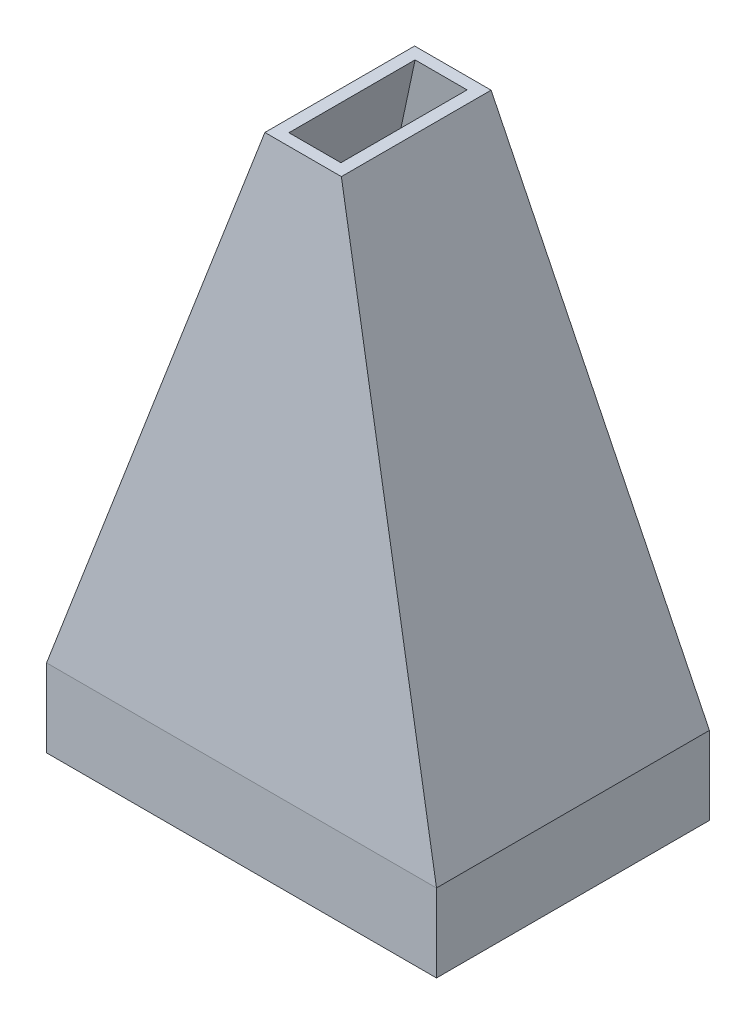
ISO-10303-21;
HEADER;
FILE_DESCRIPTION(('STEP AP214'),'2;1');
FILE_NAME('part.step','',(''),(''),'','','');
FILE_SCHEMA(('AUTOMOTIVE_DESIGN { 1 0 10303 214 1 1 1 1 }'));
ENDSEC;
DATA;
#1=APPLICATION_CONTEXT('core data for automotive mechanical design processes');
#2=APPLICATION_PROTOCOL_DEFINITION('international standard','automotive_design',2000,#1);
#3=PRODUCT_CONTEXT('',#1,'mechanical');
#4=PRODUCT('Part','Part','',(#3));
#5=PRODUCT_RELATED_PRODUCT_CATEGORY('part','',(#4));
#6=PRODUCT_DEFINITION_FORMATION('','',#4);
#7=PRODUCT_DEFINITION_CONTEXT('part definition',#1,'design');
#8=PRODUCT_DEFINITION('design','',#6,#7);
#9=PRODUCT_DEFINITION_SHAPE('','',#8);
#10=(LENGTH_UNIT() NAMED_UNIT(*) SI_UNIT(.MILLI.,.METRE.));
#11=(NAMED_UNIT(*) PLANE_ANGLE_UNIT() SI_UNIT($,.RADIAN.));
#12=(NAMED_UNIT(*) SI_UNIT($,.STERADIAN.) SOLID_ANGLE_UNIT());
#13=UNCERTAINTY_MEASURE_WITH_UNIT(LENGTH_MEASURE(1.E-05),#10,'distance_accuracy_value','');
#14=(GEOMETRIC_REPRESENTATION_CONTEXT(3) GLOBAL_UNCERTAINTY_ASSIGNED_CONTEXT((#13)) GLOBAL_UNIT_ASSIGNED_CONTEXT((#10,
#11,#12)) REPRESENTATION_CONTEXT('',''));
#15=CARTESIAN_POINT('',(0.,0.,0.));
#16=DIRECTION('',(0.,0.,1.));
#17=DIRECTION('',(1.,0.,0.));
#18=AXIS2_PLACEMENT_3D('',#15,#16,#17);
#19=CARTESIAN_POINT('',(0.,150.,0.));
#20=DIRECTION('',(0.,-1.,0.));
#21=DIRECTION('',(0.,0.,-1.));
#22=AXIS2_PLACEMENT_3D('',#19,#20,#21);
#23=PLANE('',#22);
#24=DIRECTION('',(-1.,0.,0.));
#25=VECTOR('',#24,1.);
#26=CARTESIAN_POINT('',(50.,150.,-19.2));
#27=LINE('',#26,#25);
#28=CARTESIAN_POINT('',(9.80833333333334,150.,-19.2));
#29=VERTEX_POINT('',#28);
#30=CARTESIAN_POINT('',(-9.80833333333332,150.,-19.2));
#31=VERTEX_POINT('',#30);
#32=EDGE_CURVE('E237',#29,#31,#27,.T.);
#33=ORIENTED_EDGE('',*,*,#32,.T.);
#34=DIRECTION('',(0.,0.,1.));
#35=VECTOR('',#34,1.);
#36=CARTESIAN_POINT('',(-9.80833333333332,150.,-35.));
#37=LINE('',#36,#35);
#38=CARTESIAN_POINT('',(-9.80833333333333,150.,19.2));
#39=VERTEX_POINT('',#38);
#40=EDGE_CURVE('E215',#31,#39,#37,.T.);
#41=ORIENTED_EDGE('',*,*,#40,.T.);
#42=DIRECTION('',(-1.,0.,0.));
#43=VECTOR('',#42,1.);
#44=CARTESIAN_POINT('',(50.,150.,19.2));
#45=LINE('',#44,#43);
#46=CARTESIAN_POINT('',(9.80833333333334,150.,19.2));
#47=VERTEX_POINT('',#46);
#48=EDGE_CURVE('E246',#47,#39,#45,.T.);
#49=ORIENTED_EDGE('',*,*,#48,.F.);
#50=DIRECTION('',(0.,0.,1.));
#51=VECTOR('',#50,1.);
#52=CARTESIAN_POINT('',(9.80833333333334,150.,-35.));
#53=LINE('',#52,#51);
#54=EDGE_CURVE('E223',#29,#47,#53,.T.);
#55=ORIENTED_EDGE('',*,*,#54,.F.);
#56=EDGE_LOOP('',(#33,#41,#49,#55));
#57=FACE_BOUND('',#56,.T.);
#58=DIRECTION('',(-1.,0.,0.));
#59=VECTOR('',#58,1.);
#60=CARTESIAN_POINT('',(0.,150.,-16.1779238297657));
#61=LINE('',#60,#59);
#62=CARTESIAN_POINT('',(6.66822883666449,150.,-16.1779238297657));
#63=VERTEX_POINT('',#62);
#64=CARTESIAN_POINT('',(-6.66822883666446,150.,-16.1779238297657));
#65=VERTEX_POINT('',#64);
#66=EDGE_CURVE('E157',#63,#65,#61,.T.);
#67=ORIENTED_EDGE('',*,*,#66,.F.);
#68=DIRECTION('',(0.,0.,1.));
#69=VECTOR('',#68,1.);
#70=CARTESIAN_POINT('',(6.66822883666449,150.,-35.));
#71=LINE('',#70,#69);
#72=CARTESIAN_POINT('',(6.66822883666449,150.,16.1779238297657));
#73=VERTEX_POINT('',#72);
#74=EDGE_CURVE('E165',#63,#73,#71,.T.);
#75=ORIENTED_EDGE('',*,*,#74,.T.);
#76=DIRECTION('',(-1.,0.,0.));
#77=VECTOR('',#76,1.);
#78=CARTESIAN_POINT('',(50.,150.,16.1779238297657));
#79=LINE('',#78,#77);
#80=CARTESIAN_POINT('',(-6.66822883666446,150.,16.1779238297657));
#81=VERTEX_POINT('',#80);
#82=EDGE_CURVE('E60',#73,#81,#79,.T.);
#83=ORIENTED_EDGE('',*,*,#82,.T.);
#84=DIRECTION('',(0.,0.,1.));
#85=VECTOR('',#84,1.);
#86=CARTESIAN_POINT('',(-6.66822883666446,150.,0.));
#87=LINE('',#86,#85);
#88=EDGE_CURVE('E210',#65,#81,#87,.T.);
#89=ORIENTED_EDGE('',*,*,#88,.F.);
#90=EDGE_LOOP('',(#67,#75,#83,#89));
#91=FACE_BOUND('',#90,.T.);
#92=ADVANCED_FACE('F44',(#57,#91),#23,.F.);
#93=CARTESIAN_POINT('',(0.,0.,0.));
#94=DIRECTION('',(0.,-1.,0.));
#95=DIRECTION('',(0.,0.,-1.));
#96=AXIS2_PLACEMENT_3D('',#93,#94,#95);
#97=PLANE('',#96);
#98=DIRECTION('',(0.,0.,-1.));
#99=VECTOR('',#98,1.);
#100=CARTESIAN_POINT('',(50.,0.,35.));
#101=LINE('',#100,#99);
#102=CARTESIAN_POINT('',(50.,0.,35.));
#103=VERTEX_POINT('',#102);
#104=CARTESIAN_POINT('',(50.,0.,-35.));
#105=VERTEX_POINT('',#104);
#106=EDGE_CURVE('E241',#103,#105,#101,.T.);
#107=ORIENTED_EDGE('',*,*,#106,.F.);
#108=DIRECTION('',(1.,0.,0.));
#109=VECTOR('',#108,1.);
#110=CARTESIAN_POINT('',(-50.,0.,35.));
#111=LINE('',#110,#109);
#112=CARTESIAN_POINT('',(-50.,0.,35.));
#113=VERTEX_POINT('',#112);
#114=EDGE_CURVE('E264',#113,#103,#111,.T.);
#115=ORIENTED_EDGE('',*,*,#114,.F.);
#116=DIRECTION('',(0.,0.,1.));
#117=VECTOR('',#116,1.);
#118=CARTESIAN_POINT('',(-50.,0.,35.));
#119=LINE('',#118,#117);
#120=CARTESIAN_POINT('',(-50.,0.,-35.));
#121=VERTEX_POINT('',#120);
#122=EDGE_CURVE('E260',#121,#113,#119,.T.);
#123=ORIENTED_EDGE('',*,*,#122,.F.);
#124=DIRECTION('',(-1.,0.,0.));
#125=VECTOR('',#124,1.);
#126=CARTESIAN_POINT('',(-50.,0.,-35.));
#127=LINE('',#126,#125);
#128=EDGE_CURVE('E256',#105,#121,#127,.T.);
#129=ORIENTED_EDGE('',*,*,#128,.F.);
#130=EDGE_LOOP('',(#107,#115,#123,#129));
#131=FACE_BOUND('',#130,.T.);
#132=DIRECTION('',(1.,0.,0.));
#133=VECTOR('',#132,1.);
#134=CARTESIAN_POINT('',(0.,0.,32.));
#135=LINE('',#134,#133);
#136=CARTESIAN_POINT('',(-47.,0.,32.));
#137=VERTEX_POINT('',#136);
#138=CARTESIAN_POINT('',(47.,0.,32.));
#139=VERTEX_POINT('',#138);
#140=EDGE_CURVE('E191',#137,#139,#135,.T.);
#141=ORIENTED_EDGE('',*,*,#140,.T.);
#142=DIRECTION('',(0.,0.,-1.));
#143=VECTOR('',#142,1.);
#144=CARTESIAN_POINT('',(47.,0.,0.));
#145=LINE('',#144,#143);
#146=CARTESIAN_POINT('',(47.,0.,-32.));
#147=VERTEX_POINT('',#146);
#148=EDGE_CURVE('E186',#139,#147,#145,.T.);
#149=ORIENTED_EDGE('',*,*,#148,.T.);
#150=DIRECTION('',(-1.,0.,0.));
#151=VECTOR('',#150,1.);
#152=CARTESIAN_POINT('',(0.,0.,-32.));
#153=LINE('',#152,#151);
#154=CARTESIAN_POINT('',(-47.,0.,-32.));
#155=VERTEX_POINT('',#154);
#156=EDGE_CURVE('E190',#147,#155,#153,.T.);
#157=ORIENTED_EDGE('',*,*,#156,.T.);
#158=DIRECTION('',(0.,0.,1.));
#159=VECTOR('',#158,1.);
#160=CARTESIAN_POINT('',(-47.,0.,0.));
#161=LINE('',#160,#159);
#162=EDGE_CURVE('E68',#155,#137,#161,.T.);
#163=ORIENTED_EDGE('',*,*,#162,.T.);
#164=EDGE_LOOP('',(#141,#149,#157,#163));
#165=FACE_BOUND('',#164,.T.);
#166=ADVANCED_FACE('F298',(#131,#165),#97,.T.);
#167=CARTESIAN_POINT('',(50.,150.,35.));
#168=DIRECTION('',(-1.,0.,0.));
#169=DIRECTION('',(0.,0.,1.));
#170=AXIS2_PLACEMENT_3D('',#167,#168,#169);
#171=PLANE('',#170);
#172=DIRECTION('',(0.,-1.,0.));
#173=VECTOR('',#172,1.);
#174=CARTESIAN_POINT('',(50.,150.,-35.));
#175=LINE('',#174,#173);
#176=CARTESIAN_POINT('',(50.,20.,-35.));
#177=VERTEX_POINT('',#176);
#178=EDGE_CURVE('E277',#177,#105,#175,.T.);
#179=ORIENTED_EDGE('',*,*,#178,.F.);
#180=DIRECTION('',(0.,0.,1.));
#181=VECTOR('',#180,1.);
#182=CARTESIAN_POINT('',(50.,20.,-35.));
#183=LINE('',#182,#181);
#184=CARTESIAN_POINT('',(50.,20.,35.));
#185=VERTEX_POINT('',#184);
#186=EDGE_CURVE('E179',#177,#185,#183,.T.);
#187=ORIENTED_EDGE('',*,*,#186,.T.);
#188=DIRECTION('',(0.,-1.,0.));
#189=VECTOR('',#188,1.);
#190=CARTESIAN_POINT('',(50.,150.,35.));
#191=LINE('',#190,#189);
#192=EDGE_CURVE('E268',#185,#103,#191,.T.);
#193=ORIENTED_EDGE('',*,*,#192,.T.);
#194=ORIENTED_EDGE('',*,*,#106,.T.);
#195=EDGE_LOOP('',(#179,#187,#193,#194));
#196=FACE_BOUND('',#195,.T.);
#197=ADVANCED_FACE('F46',(#196),#171,.F.);
#198=CARTESIAN_POINT('',(-50.,150.,-35.));
#199=DIRECTION('',(0.,0.,1.));
#200=DIRECTION('',(1.,0.,0.));
#201=AXIS2_PLACEMENT_3D('',#198,#199,#200);
#202=PLANE('',#201);
#203=DIRECTION('',(0.,-1.,0.));
#204=VECTOR('',#203,1.);
#205=CARTESIAN_POINT('',(-50.,150.,-35.));
#206=LINE('',#205,#204);
#207=CARTESIAN_POINT('',(-50.,20.,-35.));
#208=VERTEX_POINT('',#207);
#209=EDGE_CURVE('E274',#208,#121,#206,.T.);
#210=ORIENTED_EDGE('',*,*,#209,.F.);
#211=DIRECTION('',(-1.,0.,0.));
#212=VECTOR('',#211,1.);
#213=CARTESIAN_POINT('',(50.,20.,-35.));
#214=LINE('',#213,#212);
#215=EDGE_CURVE('E242',#177,#208,#214,.T.);
#216=ORIENTED_EDGE('',*,*,#215,.F.);
#217=ORIENTED_EDGE('',*,*,#178,.T.);
#218=ORIENTED_EDGE('',*,*,#128,.T.);
#219=EDGE_LOOP('',(#210,#216,#217,#218));
#220=FACE_BOUND('',#219,.T.);
#221=ADVANCED_FACE('F290',(#220),#202,.F.);
#222=CARTESIAN_POINT('',(-50.,150.,35.));
#223=DIRECTION('',(1.,0.,0.));
#224=DIRECTION('',(0.,0.,-1.));
#225=AXIS2_PLACEMENT_3D('',#222,#223,#224);
#226=PLANE('',#225);
#227=DIRECTION('',(0.,-1.,0.));
#228=VECTOR('',#227,1.);
#229=CARTESIAN_POINT('',(-50.,150.,35.));
#230=LINE('',#229,#228);
#231=CARTESIAN_POINT('',(-50.,20.,35.));
#232=VERTEX_POINT('',#231);
#233=EDGE_CURVE('E271',#232,#113,#230,.T.);
#234=ORIENTED_EDGE('',*,*,#233,.F.);
#235=DIRECTION('',(0.,0.,1.));
#236=VECTOR('',#235,1.);
#237=CARTESIAN_POINT('',(-50.,20.,-35.));
#238=LINE('',#237,#236);
#239=EDGE_CURVE('E220',#208,#232,#238,.T.);
#240=ORIENTED_EDGE('',*,*,#239,.F.);
#241=ORIENTED_EDGE('',*,*,#209,.T.);
#242=ORIENTED_EDGE('',*,*,#122,.T.);
#243=EDGE_LOOP('',(#234,#240,#241,#242));
#244=FACE_BOUND('',#243,.T.);
#245=ADVANCED_FACE('F303',(#244),#226,.F.);
#246=CARTESIAN_POINT('',(-50.,150.,35.));
#247=DIRECTION('',(0.,0.,-1.));
#248=DIRECTION('',(-1.,0.,0.));
#249=AXIS2_PLACEMENT_3D('',#246,#247,#248);
#250=PLANE('',#249);
#251=ORIENTED_EDGE('',*,*,#192,.F.);
#252=DIRECTION('',(-1.,0.,0.));
#253=VECTOR('',#252,1.);
#254=CARTESIAN_POINT('',(50.,20.,35.));
#255=LINE('',#254,#253);
#256=EDGE_CURVE('E236',#185,#232,#255,.T.);
#257=ORIENTED_EDGE('',*,*,#256,.T.);
#258=ORIENTED_EDGE('',*,*,#233,.T.);
#259=ORIENTED_EDGE('',*,*,#114,.T.);
#260=EDGE_LOOP('',(#251,#257,#258,#259));
#261=FACE_BOUND('',#260,.T.);
#262=ADVANCED_FACE('F311',(#261),#250,.F.);
#263=CARTESIAN_POINT('',(50.,150.,19.2));
#264=DIRECTION('',(0.,-0.120650626945353,-0.992695031828856));
#265=DIRECTION('',(0.,0.992695031828856,-0.120650626945353));
#266=AXIS2_PLACEMENT_3D('',#263,#264,#265);
#267=PLANE('',#266);
#268=ORIENTED_EDGE('',*,*,#48,.T.);
#269=DIRECTION('',(-0.293401017064594,-0.94900598511459,0.115340727421619));
#270=VECTOR('',#269,1.);
#271=CARTESIAN_POINT('',(-4.65978338785048,166.652991737411,17.1760210042224));
#272=LINE('',#271,#270);
#273=EDGE_CURVE('E232',#39,#232,#272,.T.);
#274=ORIENTED_EDGE('',*,*,#273,.T.);
#275=ORIENTED_EDGE('',*,*,#256,.F.);
#276=DIRECTION('',(-0.293401017064594,0.94900598511459,-0.115340727421619));
#277=VECTOR('',#276,1.);
#278=CARTESIAN_POINT('',(13.2681990693043,138.80905961411,20.5601296776697));
#279=LINE('',#278,#277);
#280=EDGE_CURVE('E219',#185,#47,#279,.T.);
#281=ORIENTED_EDGE('',*,*,#280,.T.);
#282=EDGE_LOOP('',(#268,#274,#275,#281));
#283=FACE_BOUND('',#282,.T.);
#284=ADVANCED_FACE('F308',(#283),#267,.F.);
#285=CARTESIAN_POINT('',(50.,20.,-35.));
#286=DIRECTION('',(0.,-0.120650626945353,0.992695031828856));
#287=DIRECTION('',(0.,-0.992695031828856,-0.120650626945353));
#288=AXIS2_PLACEMENT_3D('',#285,#286,#287);
#289=PLANE('',#288);
#290=ORIENTED_EDGE('',*,*,#215,.T.);
#291=DIRECTION('',(0.293401017064594,0.94900598511459,0.115340727421619));
#292=VECTOR('',#291,1.);
#293=CARTESIAN_POINT('',(-41.3915843185462,47.8439321233008,-31.6158913265527));
#294=LINE('',#293,#292);
#295=EDGE_CURVE('E11',#208,#31,#294,.T.);
#296=ORIENTED_EDGE('',*,*,#295,.T.);
#297=ORIENTED_EDGE('',*,*,#32,.F.);
#298=DIRECTION('',(0.293401017064594,-0.94900598511459,-0.115340727421619));
#299=VECTOR('',#298,1.);
#300=CARTESIAN_POINT('',(50.,20.,-35.));
#301=LINE('',#300,#299);
#302=EDGE_CURVE('E53',#29,#177,#301,.T.);
#303=ORIENTED_EDGE('',*,*,#302,.T.);
#304=EDGE_LOOP('',(#290,#296,#297,#303));
#305=FACE_BOUND('',#304,.T.);
#306=ADVANCED_FACE('F284',(#305),#289,.F.);
#307=CARTESIAN_POINT('',(50.,20.,-35.));
#308=DIRECTION('',(-0.955382218388755,-0.295372335851857,0.));
#309=DIRECTION('',(0.295372335851857,-0.955382218388755,0.));
#310=AXIS2_PLACEMENT_3D('',#307,#308,#309);
#311=PLANE('',#310);
#312=ORIENTED_EDGE('',*,*,#186,.F.);
#313=ORIENTED_EDGE('',*,*,#302,.F.);
#314=ORIENTED_EDGE('',*,*,#54,.T.);
#315=ORIENTED_EDGE('',*,*,#280,.F.);
#316=EDGE_LOOP('',(#312,#313,#314,#315));
#317=FACE_BOUND('',#316,.T.);
#318=ADVANCED_FACE('F331',(#317),#311,.F.);
#319=CARTESIAN_POINT('',(-50.,20.,-35.));
#320=DIRECTION('',(0.955382218388755,-0.295372335851857,0.));
#321=DIRECTION('',(0.295372335851857,0.955382218388755,0.));
#322=AXIS2_PLACEMENT_3D('',#319,#320,#321);
#323=PLANE('',#322);
#324=ORIENTED_EDGE('',*,*,#40,.F.);
#325=ORIENTED_EDGE('',*,*,#295,.F.);
#326=ORIENTED_EDGE('',*,*,#239,.T.);
#327=ORIENTED_EDGE('',*,*,#273,.F.);
#328=EDGE_LOOP('',(#324,#325,#326,#327));
#329=FACE_BOUND('',#328,.T.);
#330=ADVANCED_FACE('F306',(#329),#323,.F.);
#331=CARTESIAN_POINT('',(47.,150.,35.));
#332=DIRECTION('',(-1.,0.,0.));
#333=DIRECTION('',(0.,0.,1.));
#334=AXIS2_PLACEMENT_3D('',#331,#332,#333);
#335=PLANE('',#334);
#336=DIRECTION('',(0.,-1.,0.));
#337=VECTOR('',#336,1.);
#338=CARTESIAN_POINT('',(47.,150.,-32.));
#339=LINE('',#338,#337);
#340=CARTESIAN_POINT('',(47.,19.5468318167045,-32.));
#341=VERTEX_POINT('',#340);
#342=EDGE_CURVE('E168',#341,#147,#339,.T.);
#343=ORIENTED_EDGE('',*,*,#342,.T.);
#344=ORIENTED_EDGE('',*,*,#148,.F.);
#345=DIRECTION('',(0.,-1.,0.));
#346=VECTOR('',#345,1.);
#347=CARTESIAN_POINT('',(47.,150.,32.));
#348=LINE('',#347,#346);
#349=CARTESIAN_POINT('',(47.,19.5468318167045,32.));
#350=VERTEX_POINT('',#349);
#351=EDGE_CURVE('E195',#350,#139,#348,.T.);
#352=ORIENTED_EDGE('',*,*,#351,.F.);
#353=DIRECTION('',(0.,0.,1.));
#354=VECTOR('',#353,1.);
#355=CARTESIAN_POINT('',(47.,19.5468318167045,35.));
#356=LINE('',#355,#354);
#357=EDGE_CURVE('E207',#341,#350,#356,.T.);
#358=ORIENTED_EDGE('',*,*,#357,.F.);
#359=EDGE_LOOP('',(#343,#344,#352,#358));
#360=FACE_BOUND('',#359,.T.);
#361=ADVANCED_FACE('F336',(#360),#335,.T.);
#362=CARTESIAN_POINT('',(-50.,150.,-32.));
#363=DIRECTION('',(0.,0.,1.));
#364=DIRECTION('',(1.,0.,0.));
#365=AXIS2_PLACEMENT_3D('',#362,#363,#364);
#366=PLANE('',#365);
#367=DIRECTION('',(0.,-1.,0.));
#368=VECTOR('',#367,1.);
#369=CARTESIAN_POINT('',(-47.,150.,-32.));
#370=LINE('',#369,#368);
#371=CARTESIAN_POINT('',(-47.,19.5468318167045,-32.));
#372=VERTEX_POINT('',#371);
#373=EDGE_CURVE('E364',#372,#155,#370,.T.);
#374=ORIENTED_EDGE('',*,*,#373,.T.);
#375=ORIENTED_EDGE('',*,*,#156,.F.);
#376=ORIENTED_EDGE('',*,*,#342,.F.);
#377=DIRECTION('',(-0.295372335851857,0.955382218388755,0.));
#378=VECTOR('',#377,1.);
#379=CARTESIAN_POINT('',(47.1338533448337,19.1138829924444,-32.));
#380=LINE('',#379,#378);
#381=CARTESIAN_POINT('',(46.9160523435422,19.8183606246542,-32.));
#382=VERTEX_POINT('',#381);
#383=EDGE_CURVE('E162',#341,#382,#380,.T.);
#384=ORIENTED_EDGE('',*,*,#383,.T.);
#385=DIRECTION('',(-1.,0.,0.));
#386=VECTOR('',#385,1.);
#387=CARTESIAN_POINT('',(50.,19.8183606246542,-32.));
#388=LINE('',#387,#386);
#389=CARTESIAN_POINT('',(-46.9160523435422,19.8183606246542,-32.));
#390=VERTEX_POINT('',#389);
#391=EDGE_CURVE('E146',#382,#390,#388,.T.);
#392=ORIENTED_EDGE('',*,*,#391,.T.);
#393=DIRECTION('',(0.295372335851857,0.955382218388755,0.));
#394=VECTOR('',#393,1.);
#395=CARTESIAN_POINT('',(-10.4487012728478,137.772056810189,-32.));
#396=LINE('',#395,#394);
#397=EDGE_CURVE('E174',#372,#390,#396,.T.);
#398=ORIENTED_EDGE('',*,*,#397,.F.);
#399=EDGE_LOOP('',(#374,#375,#376,#384,#392,#398));
#400=FACE_BOUND('',#399,.T.);
#401=ADVANCED_FACE('F171',(#400),#366,.T.);
#402=CARTESIAN_POINT('',(-47.,150.,35.));
#403=DIRECTION('',(1.,0.,0.));
#404=DIRECTION('',(0.,0.,-1.));
#405=AXIS2_PLACEMENT_3D('',#402,#403,#404);
#406=PLANE('',#405);
#407=DIRECTION('',(0.,-1.,0.));
#408=VECTOR('',#407,1.);
#409=CARTESIAN_POINT('',(-47.,150.,32.));
#410=LINE('',#409,#408);
#411=CARTESIAN_POINT('',(-47.,19.5468318167045,32.));
#412=VERTEX_POINT('',#411);
#413=EDGE_CURVE('E369',#412,#137,#410,.T.);
#414=ORIENTED_EDGE('',*,*,#413,.T.);
#415=ORIENTED_EDGE('',*,*,#162,.F.);
#416=ORIENTED_EDGE('',*,*,#373,.F.);
#417=DIRECTION('',(0.,0.,1.));
#418=VECTOR('',#417,1.);
#419=CARTESIAN_POINT('',(-47.,19.5468318167045,-35.));
#420=LINE('',#419,#418);
#421=EDGE_CURVE('E206',#372,#412,#420,.T.);
#422=ORIENTED_EDGE('',*,*,#421,.T.);
#423=EDGE_LOOP('',(#414,#415,#416,#422));
#424=FACE_BOUND('',#423,.T.);
#425=ADVANCED_FACE('F351',(#424),#406,.T.);
#426=CARTESIAN_POINT('',(-50.,150.,32.));
#427=DIRECTION('',(0.,0.,-1.));
#428=DIRECTION('',(-1.,0.,0.));
#429=AXIS2_PLACEMENT_3D('',#426,#427,#428);
#430=PLANE('',#429);
#431=ORIENTED_EDGE('',*,*,#351,.T.);
#432=ORIENTED_EDGE('',*,*,#140,.F.);
#433=ORIENTED_EDGE('',*,*,#413,.F.);
#434=DIRECTION('',(0.295372335851857,0.955382218388755,0.));
#435=VECTOR('',#434,1.);
#436=CARTESIAN_POINT('',(-47.1338533448337,19.1138829924444,32.));
#437=LINE('',#436,#435);
#438=CARTESIAN_POINT('',(-46.9160523435422,19.8183606246542,32.));
#439=VERTEX_POINT('',#438);
#440=EDGE_CURVE('E182',#412,#439,#437,.T.);
#441=ORIENTED_EDGE('',*,*,#440,.T.);
#442=DIRECTION('',(-1.,0.,0.));
#443=VECTOR('',#442,1.);
#444=CARTESIAN_POINT('',(-50.,19.8183606246542,32.));
#445=LINE('',#444,#443);
#446=CARTESIAN_POINT('',(46.9160523435422,19.8183606246542,32.));
#447=VERTEX_POINT('',#446);
#448=EDGE_CURVE('E203',#447,#439,#445,.T.);
#449=ORIENTED_EDGE('',*,*,#448,.F.);
#450=DIRECTION('',(-0.295372335851857,0.955382218388755,0.));
#451=VECTOR('',#450,1.);
#452=CARTESIAN_POINT('',(1.72421959418959,165.99140455787,32.));
#453=LINE('',#452,#451);
#454=EDGE_CURVE('E175',#350,#447,#453,.T.);
#455=ORIENTED_EDGE('',*,*,#454,.F.);
#456=EDGE_LOOP('',(#431,#432,#433,#441,#449,#455));
#457=FACE_BOUND('',#456,.T.);
#458=ADVANCED_FACE('F348',(#457),#430,.T.);
#459=CARTESIAN_POINT('',(50.,149.638048119164,16.2219149045134));
#460=DIRECTION('',(0.,-0.120650626945353,-0.992695031828856));
#461=DIRECTION('',(0.,0.992695031828856,-0.120650626945353));
#462=AXIS2_PLACEMENT_3D('',#459,#460,#461);
#463=PLANE('',#462);
#464=ORIENTED_EDGE('',*,*,#82,.F.);
#465=DIRECTION('',(-0.293401017064594,0.94900598511459,-0.115340727421619));
#466=VECTOR('',#465,1.);
#467=CARTESIAN_POINT('',(10.5006781623358,137.60393749109,17.6845221962332));
#468=LINE('',#467,#466);
#469=EDGE_CURVE('E214',#447,#73,#468,.T.);
#470=ORIENTED_EDGE('',*,*,#469,.F.);
#471=ORIENTED_EDGE('',*,*,#448,.T.);
#472=DIRECTION('',(-0.293401017064594,-0.94900598511459,0.115340727421619));
#473=VECTOR('',#472,1.);
#474=CARTESIAN_POINT('',(-1.89226248088199,165.447869614391,14.3004135227859));
#475=LINE('',#474,#473);
#476=EDGE_CURVE('E384',#81,#439,#475,.T.);
#477=ORIENTED_EDGE('',*,*,#476,.F.);
#478=EDGE_LOOP('',(#464,#470,#471,#477));
#479=FACE_BOUND('',#478,.T.);
#480=ADVANCED_FACE('F345',(#479),#463,.T.);
#481=CARTESIAN_POINT('',(50.,19.6380481191639,-32.0219149045134));
#482=DIRECTION('',(0.,-0.120650626945353,0.992695031828856));
#483=DIRECTION('',(0.,-0.992695031828856,-0.120650626945353));
#484=AXIS2_PLACEMENT_3D('',#481,#482,#483);
#485=PLANE('',#484);
#486=ORIENTED_EDGE('',*,*,#391,.F.);
#487=DIRECTION('',(0.293401017064594,-0.94900598511459,-0.115340727421619));
#488=VECTOR('',#487,1.);
#489=CARTESIAN_POINT('',(47.2324790930315,18.79487787698,-32.1243925185635));
#490=LINE('',#489,#488);
#491=EDGE_CURVE('E150',#63,#382,#490,.T.);
#492=ORIENTED_EDGE('',*,*,#491,.F.);
#493=ORIENTED_EDGE('',*,*,#66,.T.);
#494=DIRECTION('',(0.293401017064594,0.94900598511459,0.115340727421619));
#495=VECTOR('',#494,1.);
#496=CARTESIAN_POINT('',(-38.6240634115777,46.6388100002807,-28.7402838451162));
#497=LINE('',#496,#495);
#498=EDGE_CURVE('E152',#390,#65,#497,.T.);
#499=ORIENTED_EDGE('',*,*,#498,.F.);
#500=EDGE_LOOP('',(#486,#492,#493,#499));
#501=FACE_BOUND('',#500,.T.);
#502=ADVANCED_FACE('F148',(#501),#485,.T.);
#503=CARTESIAN_POINT('',(47.1338533448337,19.1138829924444,-35.));
#504=DIRECTION('',(-0.955382218388755,-0.295372335851857,0.));
#505=DIRECTION('',(0.295372335851857,-0.955382218388755,0.));
#506=AXIS2_PLACEMENT_3D('',#503,#504,#505);
#507=PLANE('',#506);
#508=ORIENTED_EDGE('',*,*,#357,.T.);
#509=ORIENTED_EDGE('',*,*,#454,.T.);
#510=ORIENTED_EDGE('',*,*,#469,.T.);
#511=ORIENTED_EDGE('',*,*,#74,.F.);
#512=ORIENTED_EDGE('',*,*,#491,.T.);
#513=ORIENTED_EDGE('',*,*,#383,.F.);
#514=EDGE_LOOP('',(#508,#509,#510,#511,#512,#513));
#515=FACE_BOUND('',#514,.T.);
#516=ADVANCED_FACE('F161',(#515),#507,.T.);
#517=CARTESIAN_POINT('',(-47.1338533448337,19.1138829924444,-35.));
#518=DIRECTION('',(0.955382218388755,-0.295372335851857,0.));
#519=DIRECTION('',(0.295372335851857,0.955382218388755,0.));
#520=AXIS2_PLACEMENT_3D('',#517,#518,#519);
#521=PLANE('',#520);
#522=ORIENTED_EDGE('',*,*,#88,.T.);
#523=ORIENTED_EDGE('',*,*,#476,.T.);
#524=ORIENTED_EDGE('',*,*,#440,.F.);
#525=ORIENTED_EDGE('',*,*,#421,.F.);
#526=ORIENTED_EDGE('',*,*,#397,.T.);
#527=ORIENTED_EDGE('',*,*,#498,.T.);
#528=EDGE_LOOP('',(#522,#523,#524,#525,#526,#527));
#529=FACE_BOUND('',#528,.T.);
#530=ADVANCED_FACE('F337',(#529),#521,.T.);
#531=CLOSED_SHELL('',(#92,#166,#197,#221,#245,#262,#284,#306,#318,#330,#361,#401,#425,#458,#480,
#502,#516,#530));
#532=MANIFOLD_SOLID_BREP('B2',#531);
#533=ADVANCED_BREP_SHAPE_REPRESENTATION('',(#18,#532),#14);
#534=SHAPE_DEFINITION_REPRESENTATION(#9,#533);
ENDSEC;
END-ISO-10303-21;
